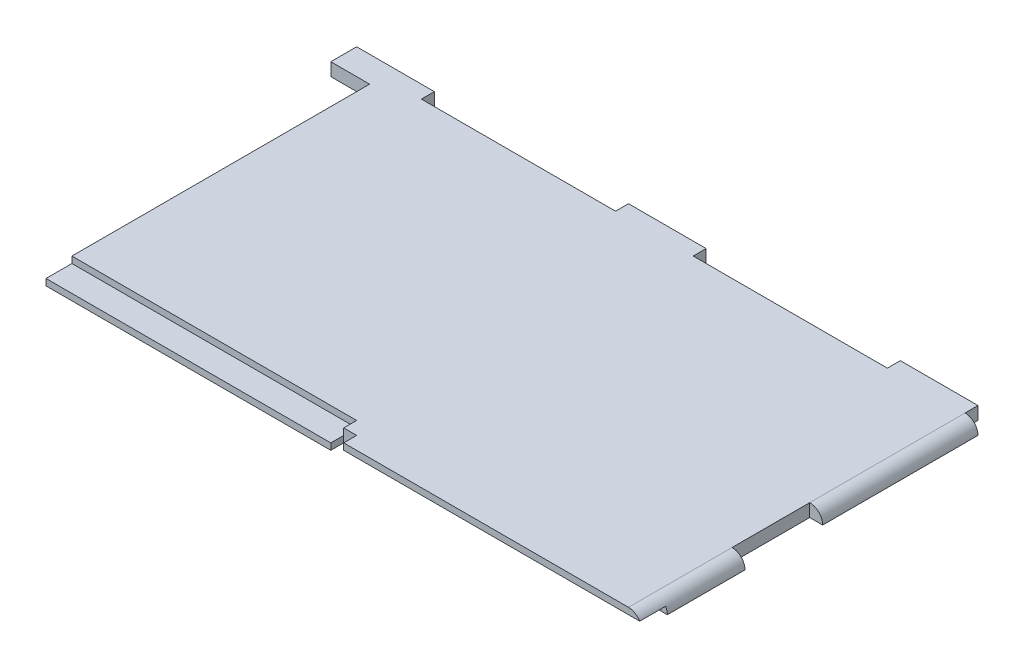
ISO-10303-21;
HEADER;
FILE_DESCRIPTION(('STEP AP214'),'2;1');
FILE_NAME('part.step','',(''),(''),'','','');
FILE_SCHEMA(('AUTOMOTIVE_DESIGN { 1 0 10303 214 1 1 1 1 }'));
ENDSEC;
DATA;
#1=APPLICATION_CONTEXT('core data for automotive mechanical design processes');
#2=APPLICATION_PROTOCOL_DEFINITION('international standard','automotive_design',2000,#1);
#3=PRODUCT_CONTEXT('',#1,'mechanical');
#4=PRODUCT('Part','Part','',(#3));
#5=PRODUCT_RELATED_PRODUCT_CATEGORY('part','',(#4));
#6=PRODUCT_DEFINITION_FORMATION('','',#4);
#7=PRODUCT_DEFINITION_CONTEXT('part definition',#1,'design');
#8=PRODUCT_DEFINITION('design','',#6,#7);
#9=PRODUCT_DEFINITION_SHAPE('','',#8);
#10=(LENGTH_UNIT() NAMED_UNIT(*) SI_UNIT(.MILLI.,.METRE.));
#11=(NAMED_UNIT(*) PLANE_ANGLE_UNIT() SI_UNIT($,.RADIAN.));
#12=(NAMED_UNIT(*) SI_UNIT($,.STERADIAN.) SOLID_ANGLE_UNIT());
#13=UNCERTAINTY_MEASURE_WITH_UNIT(LENGTH_MEASURE(1.E-05),#10,'distance_accuracy_value','');
#14=(GEOMETRIC_REPRESENTATION_CONTEXT(3) GLOBAL_UNCERTAINTY_ASSIGNED_CONTEXT((#13)) GLOBAL_UNIT_ASSIGNED_CONTEXT((#10,
#11,#12)) REPRESENTATION_CONTEXT('',''));
#15=CARTESIAN_POINT('',(0.,0.,0.));
#16=DIRECTION('',(0.,0.,1.));
#17=DIRECTION('',(1.,0.,0.));
#18=AXIS2_PLACEMENT_3D('',#15,#16,#17);
#19=CARTESIAN_POINT('',(208.746286717569,-5.,86.4649026606249));
#20=DIRECTION('',(0.,0.,-1.));
#21=DIRECTION('',(-1.,0.,0.));
#22=AXIS2_PLACEMENT_3D('',#19,#20,#21);
#23=PLANE('',#22);
#24=DIRECTION('',(-1.,0.,0.));
#25=VECTOR('',#24,1.);
#26=CARTESIAN_POINT('',(0.,0.,86.4649026606249));
#27=LINE('',#26,#25);
#28=CARTESIAN_POINT('',(88.7462867175687,0.,86.4649026606249));
#29=VERTEX_POINT('',#28);
#30=CARTESIAN_POINT('',(-21.2537132824313,0.,86.4649026606249));
#31=VERTEX_POINT('',#30);
#32=EDGE_CURVE('E658',#29,#31,#27,.T.);
#33=ORIENTED_EDGE('',*,*,#32,.F.);
#34=DIRECTION('',(0.,-1.,0.));
#35=VECTOR('',#34,1.);
#36=CARTESIAN_POINT('',(88.7462867175687,5.,86.4649026606249));
#37=LINE('',#36,#35);
#38=CARTESIAN_POINT('',(88.7462867175687,2.5,86.4649026606249));
#39=VERTEX_POINT('',#38);
#40=EDGE_CURVE('E599',#39,#29,#37,.T.);
#41=ORIENTED_EDGE('',*,*,#40,.F.);
#42=DIRECTION('',(1.,0.,0.));
#43=VECTOR('',#42,1.);
#44=CARTESIAN_POINT('',(-21.2537132824313,2.5,86.4649026606249));
#45=LINE('',#44,#43);
#46=CARTESIAN_POINT('',(-21.2537132824313,2.5,86.4649026606249));
#47=VERTEX_POINT('',#46);
#48=EDGE_CURVE('E624',#47,#39,#45,.T.);
#49=ORIENTED_EDGE('',*,*,#48,.F.);
#50=DIRECTION('',(0.,-1.,0.));
#51=VECTOR('',#50,1.);
#52=CARTESIAN_POINT('',(-21.2537132824313,5.,86.4649026606249));
#53=LINE('',#52,#51);
#54=EDGE_CURVE('E660',#47,#31,#53,.T.);
#55=ORIENTED_EDGE('',*,*,#54,.T.);
#56=EDGE_LOOP('',(#33,#41,#49,#55));
#57=FACE_BOUND('',#56,.T.);
#58=ADVANCED_FACE('F403',(#57),#23,.F.);
#59=CARTESIAN_POINT('',(93.7462867175687,2.5,76.4649026606249));
#60=DIRECTION('',(-1.,0.,0.));
#61=DIRECTION('',(0.,0.,1.));
#62=AXIS2_PLACEMENT_3D('',#59,#60,#61);
#63=PLANE('',#62);
#64=DIRECTION('',(0.,1.,0.));
#65=VECTOR('',#64,1.);
#66=CARTESIAN_POINT('',(93.7462867175687,5.,81.4649026606249));
#67=LINE('',#66,#65);
#68=CARTESIAN_POINT('',(93.7462867175687,0.,81.4649026606249));
#69=VERTEX_POINT('',#68);
#70=CARTESIAN_POINT('',(93.7462867175687,2.5,81.4649026606249));
#71=VERTEX_POINT('',#70);
#72=EDGE_CURVE('E611',#69,#71,#67,.T.);
#73=ORIENTED_EDGE('',*,*,#72,.F.);
#74=DIRECTION('',(0.,0.,1.));
#75=VECTOR('',#74,1.);
#76=CARTESIAN_POINT('',(93.7462867175687,0.,76.4649026606249));
#77=LINE('',#76,#75);
#78=CARTESIAN_POINT('',(93.7462867175687,0.,76.4649026606249));
#79=VERTEX_POINT('',#78);
#80=EDGE_CURVE('E608',#79,#69,#77,.T.);
#81=ORIENTED_EDGE('',*,*,#80,.F.);
#82=DIRECTION('',(0.,-1.,0.));
#83=VECTOR('',#82,1.);
#84=CARTESIAN_POINT('',(93.7462867175687,2.5,76.4649026606249));
#85=LINE('',#84,#83);
#86=CARTESIAN_POINT('',(93.7462867175687,2.5,76.4649026606249));
#87=VERTEX_POINT('',#86);
#88=EDGE_CURVE('E635',#87,#79,#85,.T.);
#89=ORIENTED_EDGE('',*,*,#88,.F.);
#90=DIRECTION('',(0.,0.,1.));
#91=VECTOR('',#90,1.);
#92=CARTESIAN_POINT('',(93.7462867175687,2.5,76.4649026606249));
#93=LINE('',#92,#91);
#94=EDGE_CURVE('E646',#87,#71,#93,.T.);
#95=ORIENTED_EDGE('',*,*,#94,.T.);
#96=EDGE_LOOP('',(#73,#81,#89,#95));
#97=FACE_BOUND('',#96,.T.);
#98=ADVANCED_FACE('F901',(#97),#63,.F.);
#99=CARTESIAN_POINT('',(88.7462867175687,2.5,76.4649026606249));
#100=DIRECTION('',(1.,0.,0.));
#101=DIRECTION('',(0.,0.,-1.));
#102=AXIS2_PLACEMENT_3D('',#99,#100,#101);
#103=PLANE('',#102);
#104=DIRECTION('',(0.,-1.,0.));
#105=VECTOR('',#104,1.);
#106=CARTESIAN_POINT('',(88.7462867175687,5.,81.4649026606249));
#107=LINE('',#106,#105);
#108=CARTESIAN_POINT('',(88.7462867175687,5.,81.4649026606249));
#109=VERTEX_POINT('',#108);
#110=CARTESIAN_POINT('',(88.7462867175687,2.5,81.4649026606249));
#111=VERTEX_POINT('',#110);
#112=EDGE_CURVE('E418',#109,#111,#107,.T.);
#113=ORIENTED_EDGE('',*,*,#112,.F.);
#114=DIRECTION('',(0.,0.,1.));
#115=VECTOR('',#114,1.);
#116=CARTESIAN_POINT('',(88.7462867175687,5.,76.4649026606249));
#117=LINE('',#116,#115);
#118=CARTESIAN_POINT('',(88.7462867175687,5.,76.4649026606249));
#119=VERTEX_POINT('',#118);
#120=EDGE_CURVE('E636',#119,#109,#117,.T.);
#121=ORIENTED_EDGE('',*,*,#120,.F.);
#122=DIRECTION('',(0.,1.,0.));
#123=VECTOR('',#122,1.);
#124=CARTESIAN_POINT('',(88.7462867175687,2.5,76.4649026606249));
#125=LINE('',#124,#123);
#126=CARTESIAN_POINT('',(88.7462867175687,2.5,76.4649026606249));
#127=VERTEX_POINT('',#126);
#128=EDGE_CURVE('E627',#127,#119,#125,.T.);
#129=ORIENTED_EDGE('',*,*,#128,.F.);
#130=DIRECTION('',(0.,0.,1.));
#131=VECTOR('',#130,1.);
#132=CARTESIAN_POINT('',(88.7462867175687,2.5,76.4649026606249));
#133=LINE('',#132,#131);
#134=EDGE_CURVE('E639',#127,#111,#133,.T.);
#135=ORIENTED_EDGE('',*,*,#134,.T.);
#136=EDGE_LOOP('',(#113,#121,#129,#135));
#137=FACE_BOUND('',#136,.T.);
#138=ADVANCED_FACE('F895',(#137),#103,.F.);
#139=CARTESIAN_POINT('',(203.746286717569,5.,0.));
#140=DIRECTION('',(1.,0.,0.));
#141=DIRECTION('',(0.,0.,-1.));
#142=AXIS2_PLACEMENT_3D('',#139,#140,#141);
#143=PLANE('',#142);
#144=DIRECTION('',(0.,0.,1.));
#145=VECTOR('',#144,1.);
#146=CARTESIAN_POINT('',(203.746286717569,5.,0.));
#147=LINE('',#146,#145);
#148=CARTESIAN_POINT('',(203.746286717569,5.,16.4649026606249));
#149=VERTEX_POINT('',#148);
#150=CARTESIAN_POINT('',(203.746286717569,5.,46.4649026606249));
#151=VERTEX_POINT('',#150);
#152=EDGE_CURVE('E664',#149,#151,#147,.T.);
#153=ORIENTED_EDGE('',*,*,#152,.T.);
#154=DIRECTION('',(0.,-1.,0.));
#155=VECTOR('',#154,1.);
#156=CARTESIAN_POINT('',(203.746286717569,5.,46.4649026606249));
#157=LINE('',#156,#155);
#158=CARTESIAN_POINT('',(203.746286717569,0.,46.4649026606249));
#159=VERTEX_POINT('',#158);
#160=EDGE_CURVE('E757',#151,#159,#157,.T.);
#161=ORIENTED_EDGE('',*,*,#160,.T.);
#162=DIRECTION('',(0.,0.,1.));
#163=VECTOR('',#162,1.);
#164=CARTESIAN_POINT('',(203.746286717569,0.,0.));
#165=LINE('',#164,#163);
#166=CARTESIAN_POINT('',(203.746286717569,0.,16.4649026606249));
#167=VERTEX_POINT('',#166);
#168=EDGE_CURVE('E693',#167,#159,#165,.T.);
#169=ORIENTED_EDGE('',*,*,#168,.F.);
#170=DIRECTION('',(0.,-1.,0.));
#171=VECTOR('',#170,1.);
#172=CARTESIAN_POINT('',(203.746286717569,5.,16.4649026606249));
#173=LINE('',#172,#171);
#174=EDGE_CURVE('E751',#149,#167,#173,.T.);
#175=ORIENTED_EDGE('',*,*,#174,.F.);
#176=EDGE_LOOP('',(#153,#161,#169,#175));
#177=FACE_BOUND('',#176,.T.);
#178=ADVANCED_FACE('F817',(#177),#143,.T.);
#179=CARTESIAN_POINT('',(0.,5.,16.4649026606249));
#180=DIRECTION('',(0.,0.,-1.));
#181=DIRECTION('',(-1.,0.,0.));
#182=AXIS2_PLACEMENT_3D('',#179,#180,#181);
#183=PLANE('',#182);
#184=DIRECTION('',(1.,0.,0.));
#185=VECTOR('',#184,1.);
#186=CARTESIAN_POINT('',(0.,0.,16.4649026606249));
#187=LINE('',#186,#185);
#188=CARTESIAN_POINT('',(208.746286717569,0.,16.4649026606249));
#189=VERTEX_POINT('',#188);
#190=EDGE_CURVE('E696',#167,#189,#187,.T.);
#191=ORIENTED_EDGE('',*,*,#190,.T.);
#192=CARTESIAN_POINT('',(203.746286717569,0.,16.4649026606249));
#193=DIRECTION('',(0.,0.,-1.));
#194=DIRECTION('',(-1.,0.,0.));
#195=AXIS2_PLACEMENT_3D('',#192,#193,#194);
#196=CIRCLE('',#195,5.);
#197=EDGE_CURVE('E785',#189,#149,#196,.F.);
#198=ORIENTED_EDGE('',*,*,#197,.T.);
#199=ORIENTED_EDGE('',*,*,#174,.T.);
#200=EDGE_LOOP('',(#191,#198,#199));
#201=FACE_BOUND('',#200,.T.);
#202=ADVANCED_FACE('F820',(#201),#183,.F.);
#203=CARTESIAN_POINT('',(0.,5.,-43.5350973393751));
#204=DIRECTION('',(0.,0.,-1.));
#205=DIRECTION('',(-1.,0.,0.));
#206=AXIS2_PLACEMENT_3D('',#203,#204,#205);
#207=PLANE('',#206);
#208=DIRECTION('',(0.,-1.,0.));
#209=VECTOR('',#208,1.);
#210=CARTESIAN_POINT('',(203.746286717569,5.,-43.5350973393751));
#211=LINE('',#210,#209);
#212=CARTESIAN_POINT('',(203.746286717569,5.,-43.5350973393751));
#213=VERTEX_POINT('',#212);
#214=CARTESIAN_POINT('',(203.746286717569,0.,-43.5350973393751));
#215=VERTEX_POINT('',#214);
#216=EDGE_CURVE('E749',#213,#215,#211,.T.);
#217=ORIENTED_EDGE('',*,*,#216,.F.);
#218=CARTESIAN_POINT('',(203.746286717569,0.,-43.5350973393751));
#219=DIRECTION('',(0.,0.,-1.));
#220=DIRECTION('',(-1.,0.,0.));
#221=AXIS2_PLACEMENT_3D('',#218,#219,#220);
#222=CIRCLE('',#221,5.);
#223=CARTESIAN_POINT('',(208.746286717569,0.,-43.5350973393751));
#224=VERTEX_POINT('',#223);
#225=EDGE_CURVE('E791',#213,#224,#222,.T.);
#226=ORIENTED_EDGE('',*,*,#225,.T.);
#227=DIRECTION('',(1.,0.,0.));
#228=VECTOR('',#227,1.);
#229=CARTESIAN_POINT('',(0.,0.,-43.5350973393751));
#230=LINE('',#229,#228);
#231=EDGE_CURVE('E703',#215,#224,#230,.T.);
#232=ORIENTED_EDGE('',*,*,#231,.F.);
#233=EDGE_LOOP('',(#217,#226,#232));
#234=FACE_BOUND('',#233,.T.);
#235=ADVANCED_FACE('F831',(#234),#207,.T.);
#236=CARTESIAN_POINT('',(203.746286717569,5.,0.));
#237=DIRECTION('',(-1.,0.,0.));
#238=DIRECTION('',(0.,0.,1.));
#239=AXIS2_PLACEMENT_3D('',#236,#237,#238);
#240=PLANE('',#239);
#241=DIRECTION('',(0.,0.,-1.));
#242=VECTOR('',#241,1.);
#243=CARTESIAN_POINT('',(203.746286717569,0.,0.));
#244=LINE('',#243,#242);
#245=CARTESIAN_POINT('',(203.746286717569,0.,-48.5350973393751));
#246=VERTEX_POINT('',#245);
#247=EDGE_CURVE('E706',#215,#246,#244,.T.);
#248=ORIENTED_EDGE('',*,*,#247,.T.);
#249=DIRECTION('',(0.,-1.,0.));
#250=VECTOR('',#249,1.);
#251=CARTESIAN_POINT('',(203.746286717569,5.,-48.5350973393751));
#252=LINE('',#251,#250);
#253=CARTESIAN_POINT('',(203.746286717569,5.,-48.5350973393751));
#254=VERTEX_POINT('',#253);
#255=EDGE_CURVE('E746',#254,#246,#252,.T.);
#256=ORIENTED_EDGE('',*,*,#255,.F.);
#257=DIRECTION('',(0.,0.,-1.));
#258=VECTOR('',#257,1.);
#259=CARTESIAN_POINT('',(203.746286717569,5.,0.));
#260=LINE('',#259,#258);
#261=EDGE_CURVE('E667',#213,#254,#260,.T.);
#262=ORIENTED_EDGE('',*,*,#261,.F.);
#263=ORIENTED_EDGE('',*,*,#216,.T.);
#264=EDGE_LOOP('',(#248,#256,#262,#263));
#265=FACE_BOUND('',#264,.T.);
#266=ADVANCED_FACE('F833',(#265),#240,.F.);
#267=CARTESIAN_POINT('',(0.,5.,-48.5350973393751));
#268=DIRECTION('',(0.,0.,1.));
#269=DIRECTION('',(1.,0.,0.));
#270=AXIS2_PLACEMENT_3D('',#267,#268,#269);
#271=PLANE('',#270);
#272=DIRECTION('',(-1.,0.,0.));
#273=VECTOR('',#272,1.);
#274=CARTESIAN_POINT('',(0.,0.,-48.5350973393751));
#275=LINE('',#274,#273);
#276=CARTESIAN_POINT('',(173.746286717569,0.,-48.5350973393751));
#277=VERTEX_POINT('',#276);
#278=EDGE_CURVE('E708',#246,#277,#275,.T.);
#279=ORIENTED_EDGE('',*,*,#278,.T.);
#280=DIRECTION('',(0.,-1.,0.));
#281=VECTOR('',#280,1.);
#282=CARTESIAN_POINT('',(173.746286717569,5.,-48.5350973393751));
#283=LINE('',#282,#281);
#284=CARTESIAN_POINT('',(173.746286717569,5.,-48.5350973393751));
#285=VERTEX_POINT('',#284);
#286=EDGE_CURVE('E744',#285,#277,#283,.T.);
#287=ORIENTED_EDGE('',*,*,#286,.F.);
#288=DIRECTION('',(-1.,0.,0.));
#289=VECTOR('',#288,1.);
#290=CARTESIAN_POINT('',(0.,5.,-48.5350973393751));
#291=LINE('',#290,#289);
#292=EDGE_CURVE('E670',#254,#285,#291,.T.);
#293=ORIENTED_EDGE('',*,*,#292,.F.);
#294=ORIENTED_EDGE('',*,*,#255,.T.);
#295=EDGE_LOOP('',(#279,#287,#293,#294));
#296=FACE_BOUND('',#295,.T.);
#297=ADVANCED_FACE('F838',(#296),#271,.F.);
#298=CARTESIAN_POINT('',(173.746286717569,5.,0.));
#299=DIRECTION('',(-1.,0.,0.));
#300=DIRECTION('',(0.,0.,1.));
#301=AXIS2_PLACEMENT_3D('',#298,#299,#300);
#302=PLANE('',#301);
#303=DIRECTION('',(0.,0.,-1.));
#304=VECTOR('',#303,1.);
#305=CARTESIAN_POINT('',(173.746286717569,0.,0.));
#306=LINE('',#305,#304);
#307=CARTESIAN_POINT('',(173.746286717569,0.,-43.5350973393751));
#308=VERTEX_POINT('',#307);
#309=EDGE_CURVE('E711',#308,#277,#306,.T.);
#310=ORIENTED_EDGE('',*,*,#309,.F.);
#311=DIRECTION('',(0.,-1.,0.));
#312=VECTOR('',#311,1.);
#313=CARTESIAN_POINT('',(173.746286717569,5.,-43.5350973393751));
#314=LINE('',#313,#312);
#315=CARTESIAN_POINT('',(173.746286717569,5.,-43.5350973393751));
#316=VERTEX_POINT('',#315);
#317=EDGE_CURVE('E741',#316,#308,#314,.T.);
#318=ORIENTED_EDGE('',*,*,#317,.F.);
#319=DIRECTION('',(0.,0.,-1.));
#320=VECTOR('',#319,1.);
#321=CARTESIAN_POINT('',(173.746286717569,5.,0.));
#322=LINE('',#321,#320);
#323=EDGE_CURVE('E672',#316,#285,#322,.T.);
#324=ORIENTED_EDGE('',*,*,#323,.T.);
#325=ORIENTED_EDGE('',*,*,#286,.T.);
#326=EDGE_LOOP('',(#310,#318,#324,#325));
#327=FACE_BOUND('',#326,.T.);
#328=ADVANCED_FACE('F844',(#327),#302,.T.);
#329=CARTESIAN_POINT('',(0.,5.,-43.5350973393751));
#330=DIRECTION('',(0.,0.,-1.));
#331=DIRECTION('',(-1.,0.,0.));
#332=AXIS2_PLACEMENT_3D('',#329,#330,#331);
#333=PLANE('',#332);
#334=DIRECTION('',(1.,0.,0.));
#335=VECTOR('',#334,1.);
#336=CARTESIAN_POINT('',(0.,0.,-43.5350973393751));
#337=LINE('',#336,#335);
#338=CARTESIAN_POINT('',(98.7462867175687,0.,-43.5350973393751));
#339=VERTEX_POINT('',#338);
#340=EDGE_CURVE('E714',#339,#308,#337,.T.);
#341=ORIENTED_EDGE('',*,*,#340,.F.);
#342=DIRECTION('',(0.,1.,0.));
#343=VECTOR('',#342,1.);
#344=CARTESIAN_POINT('',(98.7462867175687,5.,-43.5350973393751));
#345=LINE('',#344,#343);
#346=CARTESIAN_POINT('',(98.7462867175687,5.,-43.5350973393751));
#347=VERTEX_POINT('',#346);
#348=EDGE_CURVE('E755',#339,#347,#345,.T.);
#349=ORIENTED_EDGE('',*,*,#348,.T.);
#350=DIRECTION('',(1.,0.,0.));
#351=VECTOR('',#350,1.);
#352=CARTESIAN_POINT('',(0.,5.,-43.5350973393751));
#353=LINE('',#352,#351);
#354=EDGE_CURVE('E675',#347,#316,#353,.T.);
#355=ORIENTED_EDGE('',*,*,#354,.T.);
#356=ORIENTED_EDGE('',*,*,#317,.T.);
#357=EDGE_LOOP('',(#341,#349,#355,#356));
#358=FACE_BOUND('',#357,.T.);
#359=ADVANCED_FACE('F847',(#358),#333,.T.);
#360=DIRECTION('',(0.,1.,0.));
#361=VECTOR('',#360,1.);
#362=CARTESIAN_POINT('',(68.7462867175687,5.,-43.5350973393751));
#363=LINE('',#362,#361);
#364=CARTESIAN_POINT('',(68.7462867175687,0.,-43.5350973393751));
#365=VERTEX_POINT('',#364);
#366=CARTESIAN_POINT('',(68.7462867175687,5.,-43.5350973393751));
#367=VERTEX_POINT('',#366);
#368=EDGE_CURVE('E753',#365,#367,#363,.T.);
#369=ORIENTED_EDGE('',*,*,#368,.F.);
#370=CARTESIAN_POINT('',(-6.25371328243131,0.,-43.5350973393751));
#371=VERTEX_POINT('',#370);
#372=EDGE_CURVE('E715',#371,#365,#337,.T.);
#373=ORIENTED_EDGE('',*,*,#372,.F.);
#374=DIRECTION('',(0.,-1.,0.));
#375=VECTOR('',#374,1.);
#376=CARTESIAN_POINT('',(-6.25371328243131,5.,-43.5350973393751));
#377=LINE('',#376,#375);
#378=CARTESIAN_POINT('',(-6.25371328243131,5.,-43.5350973393751));
#379=VERTEX_POINT('',#378);
#380=EDGE_CURVE('E739',#379,#371,#377,.T.);
#381=ORIENTED_EDGE('',*,*,#380,.F.);
#382=EDGE_CURVE('E676',#379,#367,#353,.T.);
#383=ORIENTED_EDGE('',*,*,#382,.T.);
#384=EDGE_LOOP('',(#369,#373,#381,#383));
#385=FACE_BOUND('',#384,.T.);
#386=ADVANCED_FACE('F863',(#385),#333,.T.);
#387=CARTESIAN_POINT('',(-6.25371328243131,5.,0.));
#388=DIRECTION('',(-1.,0.,0.));
#389=DIRECTION('',(0.,0.,1.));
#390=AXIS2_PLACEMENT_3D('',#387,#388,#389);
#391=PLANE('',#390);
#392=DIRECTION('',(0.,0.,-1.));
#393=VECTOR('',#392,1.);
#394=CARTESIAN_POINT('',(-6.25371328243131,0.,0.));
#395=LINE('',#394,#393);
#396=CARTESIAN_POINT('',(-6.25371328243131,0.,-48.5350973393751));
#397=VERTEX_POINT('',#396);
#398=EDGE_CURVE('E718',#371,#397,#395,.T.);
#399=ORIENTED_EDGE('',*,*,#398,.T.);
#400=DIRECTION('',(0.,-1.,0.));
#401=VECTOR('',#400,1.);
#402=CARTESIAN_POINT('',(-6.25371328243131,5.,-48.5350973393751));
#403=LINE('',#402,#401);
#404=CARTESIAN_POINT('',(-6.25371328243131,5.,-48.5350973393751));
#405=VERTEX_POINT('',#404);
#406=EDGE_CURVE('E737',#405,#397,#403,.T.);
#407=ORIENTED_EDGE('',*,*,#406,.F.);
#408=DIRECTION('',(0.,0.,-1.));
#409=VECTOR('',#408,1.);
#410=CARTESIAN_POINT('',(-6.25371328243131,5.,0.));
#411=LINE('',#410,#409);
#412=EDGE_CURVE('E679',#379,#405,#411,.T.);
#413=ORIENTED_EDGE('',*,*,#412,.F.);
#414=ORIENTED_EDGE('',*,*,#380,.T.);
#415=EDGE_LOOP('',(#399,#407,#413,#414));
#416=FACE_BOUND('',#415,.T.);
#417=ADVANCED_FACE('F869',(#416),#391,.F.);
#418=CARTESIAN_POINT('',(0.,5.,-48.5350973393751));
#419=DIRECTION('',(0.,0.,-1.));
#420=DIRECTION('',(-1.,0.,0.));
#421=AXIS2_PLACEMENT_3D('',#418,#419,#420);
#422=PLANE('',#421);
#423=DIRECTION('',(1.,0.,0.));
#424=VECTOR('',#423,1.);
#425=CARTESIAN_POINT('',(0.,0.,-48.5350973393751));
#426=LINE('',#425,#424);
#427=CARTESIAN_POINT('',(-36.2537132824313,0.,-48.5350973393751));
#428=VERTEX_POINT('',#427);
#429=EDGE_CURVE('E721',#428,#397,#426,.T.);
#430=ORIENTED_EDGE('',*,*,#429,.F.);
#431=DIRECTION('',(0.,-1.,0.));
#432=VECTOR('',#431,1.);
#433=CARTESIAN_POINT('',(-36.2537132824313,5.,-48.5350973393751));
#434=LINE('',#433,#432);
#435=CARTESIAN_POINT('',(-36.2537132824313,5.,-48.5350973393751));
#436=VERTEX_POINT('',#435);
#437=EDGE_CURVE('E735',#436,#428,#434,.T.);
#438=ORIENTED_EDGE('',*,*,#437,.F.);
#439=DIRECTION('',(1.,0.,0.));
#440=VECTOR('',#439,1.);
#441=CARTESIAN_POINT('',(0.,5.,-48.5350973393751));
#442=LINE('',#441,#440);
#443=EDGE_CURVE('E681',#436,#405,#442,.T.);
#444=ORIENTED_EDGE('',*,*,#443,.T.);
#445=ORIENTED_EDGE('',*,*,#406,.T.);
#446=EDGE_LOOP('',(#430,#438,#444,#445));
#447=FACE_BOUND('',#446,.T.);
#448=ADVANCED_FACE('F873',(#447),#422,.T.);
#449=CARTESIAN_POINT('',(-36.2537132824313,5.,0.));
#450=DIRECTION('',(-1.,0.,0.));
#451=DIRECTION('',(0.,0.,1.));
#452=AXIS2_PLACEMENT_3D('',#449,#450,#451);
#453=PLANE('',#452);
#454=DIRECTION('',(0.,0.,-1.));
#455=VECTOR('',#454,1.);
#456=CARTESIAN_POINT('',(-36.2537132824313,0.,0.));
#457=LINE('',#456,#455);
#458=CARTESIAN_POINT('',(-36.2537132824313,0.,-38.5350973393751));
#459=VERTEX_POINT('',#458);
#460=EDGE_CURVE('E724',#459,#428,#457,.T.);
#461=ORIENTED_EDGE('',*,*,#460,.F.);
#462=DIRECTION('',(0.,-1.,0.));
#463=VECTOR('',#462,1.);
#464=CARTESIAN_POINT('',(-36.2537132824313,5.,-38.5350973393751));
#465=LINE('',#464,#463);
#466=CARTESIAN_POINT('',(-36.2537132824313,5.,-38.5350973393751));
#467=VERTEX_POINT('',#466);
#468=EDGE_CURVE('E733',#467,#459,#465,.T.);
#469=ORIENTED_EDGE('',*,*,#468,.F.);
#470=DIRECTION('',(0.,0.,-1.));
#471=VECTOR('',#470,1.);
#472=CARTESIAN_POINT('',(-36.2537132824313,5.,0.));
#473=LINE('',#472,#471);
#474=EDGE_CURVE('E684',#467,#436,#473,.T.);
#475=ORIENTED_EDGE('',*,*,#474,.T.);
#476=ORIENTED_EDGE('',*,*,#437,.T.);
#477=EDGE_LOOP('',(#461,#469,#475,#476));
#478=FACE_BOUND('',#477,.T.);
#479=ADVANCED_FACE('F876',(#478),#453,.T.);
#480=CARTESIAN_POINT('',(0.,5.,-38.5350973393751));
#481=DIRECTION('',(0.,0.,1.));
#482=DIRECTION('',(1.,0.,0.));
#483=AXIS2_PLACEMENT_3D('',#480,#481,#482);
#484=PLANE('',#483);
#485=DIRECTION('',(-1.,0.,0.));
#486=VECTOR('',#485,1.);
#487=CARTESIAN_POINT('',(0.,0.,-38.5350973393751));
#488=LINE('',#487,#486);
#489=CARTESIAN_POINT('',(-21.2537132824313,0.,-38.5350973393751));
#490=VERTEX_POINT('',#489);
#491=EDGE_CURVE('E727',#490,#459,#488,.T.);
#492=ORIENTED_EDGE('',*,*,#491,.F.);
#493=DIRECTION('',(0.,-1.,0.));
#494=VECTOR('',#493,1.);
#495=CARTESIAN_POINT('',(-21.2537132824313,5.,-38.5350973393751));
#496=LINE('',#495,#494);
#497=CARTESIAN_POINT('',(-21.2537132824313,5.,-38.5350973393751));
#498=VERTEX_POINT('',#497);
#499=EDGE_CURVE('E692',#498,#490,#496,.T.);
#500=ORIENTED_EDGE('',*,*,#499,.F.);
#501=DIRECTION('',(-1.,0.,0.));
#502=VECTOR('',#501,1.);
#503=CARTESIAN_POINT('',(0.,5.,-38.5350973393751));
#504=LINE('',#503,#502);
#505=EDGE_CURVE('E687',#498,#467,#504,.T.);
#506=ORIENTED_EDGE('',*,*,#505,.T.);
#507=ORIENTED_EDGE('',*,*,#468,.T.);
#508=EDGE_LOOP('',(#492,#500,#506,#507));
#509=FACE_BOUND('',#508,.T.);
#510=ADVANCED_FACE('F882',(#509),#484,.T.);
#511=CARTESIAN_POINT('',(-21.2537132824313,5.,0.));
#512=DIRECTION('',(-1.,0.,0.));
#513=DIRECTION('',(0.,0.,1.));
#514=AXIS2_PLACEMENT_3D('',#511,#512,#513);
#515=PLANE('',#514);
#516=DIRECTION('',(0.,0.,1.));
#517=VECTOR('',#516,1.);
#518=CARTESIAN_POINT('',(-21.2537132824313,2.5,76.4649026606249));
#519=LINE('',#518,#517);
#520=CARTESIAN_POINT('',(-21.2537132824313,2.5,76.4649026606249));
#521=VERTEX_POINT('',#520);
#522=EDGE_CURVE('E632',#521,#47,#519,.T.);
#523=ORIENTED_EDGE('',*,*,#522,.F.);
#524=DIRECTION('',(0.,-1.,0.));
#525=VECTOR('',#524,1.);
#526=CARTESIAN_POINT('',(-21.2537132824313,2.5,76.4649026606249));
#527=LINE('',#526,#525);
#528=CARTESIAN_POINT('',(-21.2537132824313,5.,76.4649026606249));
#529=VERTEX_POINT('',#528);
#530=EDGE_CURVE('E620',#529,#521,#527,.T.);
#531=ORIENTED_EDGE('',*,*,#530,.F.);
#532=DIRECTION('',(0.,0.,-1.));
#533=VECTOR('',#532,1.);
#534=CARTESIAN_POINT('',(-21.2537132824313,5.,0.));
#535=LINE('',#534,#533);
#536=EDGE_CURVE('E690',#529,#498,#535,.T.);
#537=ORIENTED_EDGE('',*,*,#536,.T.);
#538=ORIENTED_EDGE('',*,*,#499,.T.);
#539=DIRECTION('',(0.,0.,-1.));
#540=VECTOR('',#539,1.);
#541=CARTESIAN_POINT('',(-21.2537132824313,0.,0.));
#542=LINE('',#541,#540);
#543=EDGE_CURVE('E668',#31,#490,#542,.T.);
#544=ORIENTED_EDGE('',*,*,#543,.F.);
#545=ORIENTED_EDGE('',*,*,#54,.F.);
#546=EDGE_LOOP('',(#523,#531,#537,#538,#544,#545));
#547=FACE_BOUND('',#546,.T.);
#548=ADVANCED_FACE('F886',(#547),#515,.T.);
#549=CARTESIAN_POINT('',(0.,0.,0.));
#550=DIRECTION('',(0.,1.,0.));
#551=DIRECTION('',(0.,0.,1.));
#552=AXIS2_PLACEMENT_3D('',#549,#550,#551);
#553=PLANE('',#552);
#554=DIRECTION('',(1.,0.,0.));
#555=VECTOR('',#554,1.);
#556=CARTESIAN_POINT('',(88.7462867175687,0.,81.4649026606249));
#557=LINE('',#556,#555);
#558=CARTESIAN_POINT('',(88.7462867175687,0.,81.4649026606249));
#559=VERTEX_POINT('',#558);
#560=EDGE_CURVE('E589',#559,#69,#557,.T.);
#561=ORIENTED_EDGE('',*,*,#560,.F.);
#562=DIRECTION('',(0.,0.,1.));
#563=VECTOR('',#562,1.);
#564=CARTESIAN_POINT('',(88.7462867175687,0.,81.4649026606249));
#565=LINE('',#564,#563);
#566=EDGE_CURVE('E596',#559,#29,#565,.T.);
#567=ORIENTED_EDGE('',*,*,#566,.T.);
#568=ORIENTED_EDGE('',*,*,#32,.T.);
#569=ORIENTED_EDGE('',*,*,#543,.T.);
#570=ORIENTED_EDGE('',*,*,#491,.T.);
#571=ORIENTED_EDGE('',*,*,#460,.T.);
#572=ORIENTED_EDGE('',*,*,#429,.T.);
#573=ORIENTED_EDGE('',*,*,#398,.F.);
#574=ORIENTED_EDGE('',*,*,#372,.T.);
#575=DIRECTION('',(0.,0.,-1.));
#576=VECTOR('',#575,1.);
#577=CARTESIAN_POINT('',(68.7462867175687,0.,-43.5350973393751));
#578=LINE('',#577,#576);
#579=CARTESIAN_POINT('',(68.7462867175687,0.,-48.5350973393751));
#580=VERTEX_POINT('',#579);
#581=EDGE_CURVE('E774',#365,#580,#578,.T.);
#582=ORIENTED_EDGE('',*,*,#581,.T.);
#583=DIRECTION('',(1.,0.,0.));
#584=VECTOR('',#583,1.);
#585=CARTESIAN_POINT('',(83.7462867175687,0.,-48.5350973393751));
#586=LINE('',#585,#584);
#587=CARTESIAN_POINT('',(98.7462867175687,0.,-48.5350973393751));
#588=VERTEX_POINT('',#587);
#589=EDGE_CURVE('E761',#580,#588,#586,.T.);
#590=ORIENTED_EDGE('',*,*,#589,.T.);
#591=DIRECTION('',(0.,0.,-1.));
#592=VECTOR('',#591,1.);
#593=CARTESIAN_POINT('',(98.7462867175687,0.,-43.5350973393751));
#594=LINE('',#593,#592);
#595=EDGE_CURVE('E764',#339,#588,#594,.T.);
#596=ORIENTED_EDGE('',*,*,#595,.F.);
#597=ORIENTED_EDGE('',*,*,#340,.T.);
#598=ORIENTED_EDGE('',*,*,#309,.T.);
#599=ORIENTED_EDGE('',*,*,#278,.F.);
#600=ORIENTED_EDGE('',*,*,#247,.F.);
#601=ORIENTED_EDGE('',*,*,#231,.T.);
#602=DIRECTION('',(0.,0.,1.));
#603=VECTOR('',#602,1.);
#604=CARTESIAN_POINT('',(208.746286717569,0.,0.));
#605=LINE('',#604,#603);
#606=EDGE_CURVE('E700',#224,#189,#605,.T.);
#607=ORIENTED_EDGE('',*,*,#606,.T.);
#608=ORIENTED_EDGE('',*,*,#190,.F.);
#609=ORIENTED_EDGE('',*,*,#168,.T.);
#610=DIRECTION('',(1.,0.,0.));
#611=VECTOR('',#610,1.);
#612=CARTESIAN_POINT('',(203.746286717569,0.,46.4649026606249));
#613=LINE('',#612,#611);
#614=CARTESIAN_POINT('',(208.746286717569,0.,46.4649026606249));
#615=VERTEX_POINT('',#614);
#616=EDGE_CURVE('E663',#159,#615,#613,.T.);
#617=ORIENTED_EDGE('',*,*,#616,.T.);
#618=DIRECTION('',(0.,0.,1.));
#619=VECTOR('',#618,1.);
#620=CARTESIAN_POINT('',(208.746286717569,0.,46.4649026606249));
#621=LINE('',#620,#619);
#622=CARTESIAN_POINT('',(208.746286717569,0.,76.4649026606249));
#623=VERTEX_POINT('',#622);
#624=EDGE_CURVE('E777',#615,#623,#621,.T.);
#625=ORIENTED_EDGE('',*,*,#624,.T.);
#626=DIRECTION('',(1.,0.,0.));
#627=VECTOR('',#626,1.);
#628=CARTESIAN_POINT('',(93.7462867175687,0.,76.4649026606249));
#629=LINE('',#628,#627);
#630=EDGE_CURVE('E650',#79,#623,#629,.T.);
#631=ORIENTED_EDGE('',*,*,#630,.F.);
#632=ORIENTED_EDGE('',*,*,#80,.T.);
#633=EDGE_LOOP('',(#561,#567,#568,#569,#570,#571,#572,#573,#574,#582,#590,#596,#597,#598,#599,
#600,#601,#607,#608,#609,#617,#625,#631,#632));
#634=FACE_BOUND('',#633,.T.);
#635=ADVANCED_FACE('F606',(#634),#553,.F.);
#636=CARTESIAN_POINT('',(0.,5.,0.));
#637=DIRECTION('',(0.,1.,0.));
#638=DIRECTION('',(0.,0.,1.));
#639=AXIS2_PLACEMENT_3D('',#636,#637,#638);
#640=PLANE('',#639);
#641=DIRECTION('',(0.,0.,1.));
#642=VECTOR('',#641,1.);
#643=CARTESIAN_POINT('',(93.7462867175687,5.,81.4649026606249));
#644=LINE('',#643,#642);
#645=CARTESIAN_POINT('',(93.7462867175687,5.,81.4649026606249));
#646=VERTEX_POINT('',#645);
#647=CARTESIAN_POINT('',(93.7462867175687,5.,86.4649026606249));
#648=VERTEX_POINT('',#647);
#649=EDGE_CURVE('E602',#646,#648,#644,.T.);
#650=ORIENTED_EDGE('',*,*,#649,.T.);
#651=DIRECTION('',(-1.,0.,0.));
#652=VECTOR('',#651,1.);
#653=CARTESIAN_POINT('',(208.746286717569,5.,86.4649026606249));
#654=LINE('',#653,#652);
#655=CARTESIAN_POINT('',(203.746286717569,5.,86.4649026606249));
#656=VERTEX_POINT('',#655);
#657=EDGE_CURVE('E655',#656,#648,#654,.T.);
#658=ORIENTED_EDGE('',*,*,#657,.F.);
#659=DIRECTION('',(0.,0.,1.));
#660=VECTOR('',#659,1.);
#661=CARTESIAN_POINT('',(203.746286717569,5.,0.));
#662=LINE('',#661,#660);
#663=EDGE_CURVE('E787',#656,#151,#662,.F.);
#664=ORIENTED_EDGE('',*,*,#663,.T.);
#665=ORIENTED_EDGE('',*,*,#152,.F.);
#666=DIRECTION('',(0.,0.,1.));
#667=VECTOR('',#666,1.);
#668=CARTESIAN_POINT('',(203.746286717569,5.,0.));
#669=LINE('',#668,#667);
#670=EDGE_CURVE('E789',#149,#213,#669,.F.);
#671=ORIENTED_EDGE('',*,*,#670,.T.);
#672=ORIENTED_EDGE('',*,*,#261,.T.);
#673=ORIENTED_EDGE('',*,*,#292,.T.);
#674=ORIENTED_EDGE('',*,*,#323,.F.);
#675=ORIENTED_EDGE('',*,*,#354,.F.);
#676=DIRECTION('',(0.,0.,-1.));
#677=VECTOR('',#676,1.);
#678=CARTESIAN_POINT('',(98.7462867175687,5.,-43.5350973393751));
#679=LINE('',#678,#677);
#680=CARTESIAN_POINT('',(98.7462867175687,5.,-48.5350973393751));
#681=VERTEX_POINT('',#680);
#682=EDGE_CURVE('E758',#347,#681,#679,.T.);
#683=ORIENTED_EDGE('',*,*,#682,.T.);
#684=DIRECTION('',(1.,0.,0.));
#685=VECTOR('',#684,1.);
#686=CARTESIAN_POINT('',(83.7462867175687,5.,-48.5350973393751));
#687=LINE('',#686,#685);
#688=CARTESIAN_POINT('',(68.7462867175687,5.,-48.5350973393751));
#689=VERTEX_POINT('',#688);
#690=EDGE_CURVE('E760',#689,#681,#687,.T.);
#691=ORIENTED_EDGE('',*,*,#690,.F.);
#692=DIRECTION('',(0.,0.,-1.));
#693=VECTOR('',#692,1.);
#694=CARTESIAN_POINT('',(68.7462867175687,5.,-43.5350973393751));
#695=LINE('',#694,#693);
#696=EDGE_CURVE('E771',#367,#689,#695,.T.);
#697=ORIENTED_EDGE('',*,*,#696,.F.);
#698=ORIENTED_EDGE('',*,*,#382,.F.);
#699=ORIENTED_EDGE('',*,*,#412,.T.);
#700=ORIENTED_EDGE('',*,*,#443,.F.);
#701=ORIENTED_EDGE('',*,*,#474,.F.);
#702=ORIENTED_EDGE('',*,*,#505,.F.);
#703=ORIENTED_EDGE('',*,*,#536,.F.);
#704=DIRECTION('',(-1.,0.,0.));
#705=VECTOR('',#704,1.);
#706=CARTESIAN_POINT('',(-21.2537132824313,5.,76.4649026606249));
#707=LINE('',#706,#705);
#708=EDGE_CURVE('E630',#119,#529,#707,.T.);
#709=ORIENTED_EDGE('',*,*,#708,.F.);
#710=ORIENTED_EDGE('',*,*,#120,.T.);
#711=DIRECTION('',(-1.,0.,0.));
#712=VECTOR('',#711,1.);
#713=CARTESIAN_POINT('',(88.7462867175687,5.,81.4649026606249));
#714=LINE('',#713,#712);
#715=EDGE_CURVE('E603',#646,#109,#714,.T.);
#716=ORIENTED_EDGE('',*,*,#715,.F.);
#717=EDGE_LOOP('',(#650,#658,#664,#665,#671,#672,#673,#674,#675,#683,#691,#697,#698,#699,#700,
#701,#702,#703,#709,#710,#716));
#718=FACE_BOUND('',#717,.T.);
#719=ADVANCED_FACE('F809',(#718),#640,.T.);
#720=CARTESIAN_POINT('',(203.746286717569,5.,46.4649026606249));
#721=DIRECTION('',(0.,0.,-1.));
#722=DIRECTION('',(-1.,0.,0.));
#723=AXIS2_PLACEMENT_3D('',#720,#721,#722);
#724=PLANE('',#723);
#725=ORIENTED_EDGE('',*,*,#160,.F.);
#726=CARTESIAN_POINT('',(203.746286717569,0.,46.4649026606249));
#727=DIRECTION('',(0.,0.,-1.));
#728=DIRECTION('',(-1.,0.,0.));
#729=AXIS2_PLACEMENT_3D('',#726,#727,#728);
#730=CIRCLE('',#729,5.);
#731=EDGE_CURVE('E793',#151,#615,#730,.T.);
#732=ORIENTED_EDGE('',*,*,#731,.T.);
#733=ORIENTED_EDGE('',*,*,#616,.F.);
#734=EDGE_LOOP('',(#725,#732,#733));
#735=FACE_BOUND('',#734,.T.);
#736=ADVANCED_FACE('F813',(#735),#724,.T.);
#737=CARTESIAN_POINT('',(98.7462867175687,5.,-43.5350973393751));
#738=DIRECTION('',(-1.,0.,0.));
#739=DIRECTION('',(0.,0.,1.));
#740=AXIS2_PLACEMENT_3D('',#737,#738,#739);
#741=PLANE('',#740);
#742=ORIENTED_EDGE('',*,*,#595,.T.);
#743=DIRECTION('',(0.,-1.,0.));
#744=VECTOR('',#743,1.);
#745=CARTESIAN_POINT('',(98.7462867175687,5.,-48.5350973393751));
#746=LINE('',#745,#744);
#747=EDGE_CURVE('E697',#681,#588,#746,.T.);
#748=ORIENTED_EDGE('',*,*,#747,.F.);
#749=ORIENTED_EDGE('',*,*,#682,.F.);
#750=ORIENTED_EDGE('',*,*,#348,.F.);
#751=EDGE_LOOP('',(#742,#748,#749,#750));
#752=FACE_BOUND('',#751,.T.);
#753=ADVANCED_FACE('F852',(#752),#741,.F.);
#754=CARTESIAN_POINT('',(83.7462867175687,5.,-48.5350973393751));
#755=DIRECTION('',(0.,0.,-1.));
#756=DIRECTION('',(-1.,0.,0.));
#757=AXIS2_PLACEMENT_3D('',#754,#755,#756);
#758=PLANE('',#757);
#759=ORIENTED_EDGE('',*,*,#589,.F.);
#760=DIRECTION('',(0.,-1.,0.));
#761=VECTOR('',#760,1.);
#762=CARTESIAN_POINT('',(68.7462867175687,5.,-48.5350973393751));
#763=LINE('',#762,#761);
#764=EDGE_CURVE('E767',#689,#580,#763,.T.);
#765=ORIENTED_EDGE('',*,*,#764,.F.);
#766=ORIENTED_EDGE('',*,*,#690,.T.);
#767=ORIENTED_EDGE('',*,*,#747,.T.);
#768=EDGE_LOOP('',(#759,#765,#766,#767));
#769=FACE_BOUND('',#768,.T.);
#770=ADVANCED_FACE('F857',(#769),#758,.T.);
#771=CARTESIAN_POINT('',(68.7462867175687,5.,-43.5350973393751));
#772=DIRECTION('',(-1.,0.,0.));
#773=DIRECTION('',(0.,0.,1.));
#774=AXIS2_PLACEMENT_3D('',#771,#772,#773);
#775=PLANE('',#774);
#776=ORIENTED_EDGE('',*,*,#581,.F.);
#777=ORIENTED_EDGE('',*,*,#368,.T.);
#778=ORIENTED_EDGE('',*,*,#696,.T.);
#779=ORIENTED_EDGE('',*,*,#764,.T.);
#780=EDGE_LOOP('',(#776,#777,#778,#779));
#781=FACE_BOUND('',#780,.T.);
#782=ADVANCED_FACE('F860',(#781),#775,.T.);
#783=CARTESIAN_POINT('',(203.746286717569,0.,0.));
#784=DIRECTION('',(0.,0.,1.));
#785=DIRECTION('',(1.,0.,0.));
#786=AXIS2_PLACEMENT_3D('',#783,#784,#785);
#787=CYLINDRICAL_SURFACE('',#786,5.);
#788=ORIENTED_EDGE('',*,*,#225,.F.);
#789=ORIENTED_EDGE('',*,*,#670,.F.);
#790=ORIENTED_EDGE('',*,*,#197,.F.);
#791=ORIENTED_EDGE('',*,*,#606,.F.);
#792=EDGE_LOOP('',(#788,#789,#790,#791));
#793=FACE_BOUND('',#792,.T.);
#794=ADVANCED_FACE('F826',(#793),#787,.T.);
#795=CARTESIAN_POINT('',(203.746286717569,0.,46.4649026606249));
#796=DIRECTION('',(0.,0.,1.));
#797=DIRECTION('',(1.,0.,0.));
#798=AXIS2_PLACEMENT_3D('',#795,#796,#797);
#799=CYLINDRICAL_SURFACE('',#798,5.);
#800=DIRECTION('',(0.,0.,1.));
#801=VECTOR('',#800,1.);
#802=CARTESIAN_POINT('',(208.076413736491,2.5,46.4649026606249));
#803=LINE('',#802,#801);
#804=CARTESIAN_POINT('',(208.076413736491,2.5,76.4649026606249));
#805=VERTEX_POINT('',#804);
#806=CARTESIAN_POINT('',(208.076413736491,2.5,86.4649026606249));
#807=VERTEX_POINT('',#806);
#808=EDGE_CURVE('E426',#805,#807,#803,.T.);
#809=ORIENTED_EDGE('',*,*,#808,.F.);
#810=CARTESIAN_POINT('',(203.746286717569,0.,76.4649026606249));
#811=DIRECTION('',(0.,0.,1.));
#812=DIRECTION('',(1.,0.,0.));
#813=AXIS2_PLACEMENT_3D('',#810,#811,#812);
#814=CIRCLE('',#813,5.);
#815=EDGE_CURVE('E12',#805,#623,#814,.F.);
#816=ORIENTED_EDGE('',*,*,#815,.T.);
#817=ORIENTED_EDGE('',*,*,#624,.F.);
#818=ORIENTED_EDGE('',*,*,#731,.F.);
#819=ORIENTED_EDGE('',*,*,#663,.F.);
#820=CARTESIAN_POINT('',(203.746286717569,0.,86.4649026606249));
#821=DIRECTION('',(0.,0.,-1.));
#822=DIRECTION('',(-1.,0.,0.));
#823=AXIS2_PLACEMENT_3D('',#820,#821,#822);
#824=CIRCLE('',#823,5.);
#825=EDGE_CURVE('E795',#807,#656,#824,.F.);
#826=ORIENTED_EDGE('',*,*,#825,.F.);
#827=EDGE_LOOP('',(#809,#816,#817,#818,#819,#826));
#828=FACE_BOUND('',#827,.T.);
#829=ADVANCED_FACE('F405',(#828),#799,.T.);
#830=ORIENTED_EDGE('',*,*,#657,.T.);
#831=DIRECTION('',(0.,1.,0.));
#832=VECTOR('',#831,1.);
#833=CARTESIAN_POINT('',(93.7462867175687,5.,86.4649026606249));
#834=LINE('',#833,#832);
#835=CARTESIAN_POINT('',(93.7462867175687,2.5,86.4649026606249));
#836=VERTEX_POINT('',#835);
#837=EDGE_CURVE('E593',#836,#648,#834,.T.);
#838=ORIENTED_EDGE('',*,*,#837,.F.);
#839=DIRECTION('',(1.,0.,0.));
#840=VECTOR('',#839,1.);
#841=CARTESIAN_POINT('',(208.746286717569,2.5,86.4649026606249));
#842=LINE('',#841,#840);
#843=EDGE_CURVE('E411',#836,#807,#842,.T.);
#844=ORIENTED_EDGE('',*,*,#843,.T.);
#845=ORIENTED_EDGE('',*,*,#825,.T.);
#846=EDGE_LOOP('',(#830,#838,#844,#845));
#847=FACE_BOUND('',#846,.T.);
#848=ADVANCED_FACE('F799',(#847),#23,.F.);
#849=CARTESIAN_POINT('',(93.7462867175687,2.5,76.4649026606249));
#850=DIRECTION('',(0.,1.,0.));
#851=DIRECTION('',(0.,0.,1.));
#852=AXIS2_PLACEMENT_3D('',#849,#850,#851);
#853=PLANE('',#852);
#854=ORIENTED_EDGE('',*,*,#808,.T.);
#855=ORIENTED_EDGE('',*,*,#843,.F.);
#856=EDGE_CURVE('E618',#71,#836,#93,.T.);
#857=ORIENTED_EDGE('',*,*,#856,.F.);
#858=ORIENTED_EDGE('',*,*,#94,.F.);
#859=DIRECTION('',(-1.,0.,0.));
#860=VECTOR('',#859,1.);
#861=CARTESIAN_POINT('',(93.7462867175687,2.5,76.4649026606249));
#862=LINE('',#861,#860);
#863=EDGE_CURVE('E645',#805,#87,#862,.T.);
#864=ORIENTED_EDGE('',*,*,#863,.F.);
#865=EDGE_LOOP('',(#854,#855,#857,#858,#864));
#866=FACE_BOUND('',#865,.T.);
#867=ADVANCED_FACE('F912',(#866),#853,.F.);
#868=CARTESIAN_POINT('',(0.,0.,76.4649026606249));
#869=DIRECTION('',(0.,0.,1.));
#870=DIRECTION('',(1.,0.,0.));
#871=AXIS2_PLACEMENT_3D('',#868,#869,#870);
#872=PLANE('',#871);
#873=ORIENTED_EDGE('',*,*,#863,.T.);
#874=ORIENTED_EDGE('',*,*,#88,.T.);
#875=ORIENTED_EDGE('',*,*,#630,.T.);
#876=ORIENTED_EDGE('',*,*,#815,.F.);
#877=EDGE_LOOP('',(#873,#874,#875,#876));
#878=FACE_BOUND('',#877,.T.);
#879=ADVANCED_FACE('F917',(#878),#872,.T.);
#880=CARTESIAN_POINT('',(-21.2537132824313,2.5,76.4649026606249));
#881=DIRECTION('',(0.,-1.,0.));
#882=DIRECTION('',(0.,0.,-1.));
#883=AXIS2_PLACEMENT_3D('',#880,#881,#882);
#884=PLANE('',#883);
#885=ORIENTED_EDGE('',*,*,#48,.T.);
#886=EDGE_CURVE('E642',#111,#39,#133,.T.);
#887=ORIENTED_EDGE('',*,*,#886,.F.);
#888=ORIENTED_EDGE('',*,*,#134,.F.);
#889=DIRECTION('',(1.,0.,0.));
#890=VECTOR('',#889,1.);
#891=CARTESIAN_POINT('',(-21.2537132824313,2.5,76.4649026606249));
#892=LINE('',#891,#890);
#893=EDGE_CURVE('E623',#521,#127,#892,.T.);
#894=ORIENTED_EDGE('',*,*,#893,.F.);
#895=ORIENTED_EDGE('',*,*,#522,.T.);
#896=EDGE_LOOP('',(#885,#887,#888,#894,#895));
#897=FACE_BOUND('',#896,.T.);
#898=ADVANCED_FACE('F897',(#897),#884,.F.);
#899=CARTESIAN_POINT('',(0.,0.,76.4649026606249));
#900=DIRECTION('',(0.,0.,-1.));
#901=DIRECTION('',(-1.,0.,0.));
#902=AXIS2_PLACEMENT_3D('',#899,#900,#901);
#903=PLANE('',#902);
#904=ORIENTED_EDGE('',*,*,#530,.T.);
#905=ORIENTED_EDGE('',*,*,#893,.T.);
#906=ORIENTED_EDGE('',*,*,#128,.T.);
#907=ORIENTED_EDGE('',*,*,#708,.T.);
#908=EDGE_LOOP('',(#904,#905,#906,#907));
#909=FACE_BOUND('',#908,.T.);
#910=ADVANCED_FACE('F892',(#909),#903,.F.);
#911=CARTESIAN_POINT('',(93.7462867175687,5.,81.4649026606249));
#912=DIRECTION('',(1.,0.,0.));
#913=DIRECTION('',(0.,0.,-1.));
#914=AXIS2_PLACEMENT_3D('',#911,#912,#913);
#915=PLANE('',#914);
#916=ORIENTED_EDGE('',*,*,#837,.T.);
#917=ORIENTED_EDGE('',*,*,#649,.F.);
#918=EDGE_CURVE('E609',#71,#646,#67,.T.);
#919=ORIENTED_EDGE('',*,*,#918,.F.);
#920=ORIENTED_EDGE('',*,*,#856,.T.);
#921=EDGE_LOOP('',(#916,#917,#919,#920));
#922=FACE_BOUND('',#921,.T.);
#923=ADVANCED_FACE('F991',(#922),#915,.F.);
#924=CARTESIAN_POINT('',(88.7462867175687,5.,81.4649026606249));
#925=DIRECTION('',(-1.,0.,0.));
#926=DIRECTION('',(0.,0.,1.));
#927=AXIS2_PLACEMENT_3D('',#924,#925,#926);
#928=PLANE('',#927);
#929=ORIENTED_EDGE('',*,*,#40,.T.);
#930=ORIENTED_EDGE('',*,*,#566,.F.);
#931=EDGE_CURVE('E584',#111,#559,#107,.T.);
#932=ORIENTED_EDGE('',*,*,#931,.F.);
#933=ORIENTED_EDGE('',*,*,#886,.T.);
#934=EDGE_LOOP('',(#929,#930,#932,#933));
#935=FACE_BOUND('',#934,.T.);
#936=ADVANCED_FACE('F597',(#935),#928,.F.);
#937=CARTESIAN_POINT('',(0.,0.,81.4649026606249));
#938=DIRECTION('',(0.,0.,1.));
#939=DIRECTION('',(1.,0.,0.));
#940=AXIS2_PLACEMENT_3D('',#937,#938,#939);
#941=PLANE('',#940);
#942=ORIENTED_EDGE('',*,*,#112,.T.);
#943=ORIENTED_EDGE('',*,*,#931,.T.);
#944=ORIENTED_EDGE('',*,*,#560,.T.);
#945=ORIENTED_EDGE('',*,*,#72,.T.);
#946=ORIENTED_EDGE('',*,*,#918,.T.);
#947=ORIENTED_EDGE('',*,*,#715,.T.);
#948=EDGE_LOOP('',(#942,#943,#944,#945,#946,#947));
#949=FACE_BOUND('',#948,.T.);
#950=ADVANCED_FACE('F586',(#949),#941,.T.);
#951=CLOSED_SHELL('',(#58,#98,#138,#178,#202,#235,#266,#297,#328,#359,#386,#417,#448,#479,#510,
#548,#635,#719,#736,#753,#770,#782,#794,#829,#848,#867,#879,#898,#910,#923,#936,#950));
#952=MANIFOLD_SOLID_BREP('B2',#951);
#953=ADVANCED_BREP_SHAPE_REPRESENTATION('',(#18,#952),#14);
#954=SHAPE_DEFINITION_REPRESENTATION(#9,#953);
ENDSEC;
END-ISO-10303-21;
